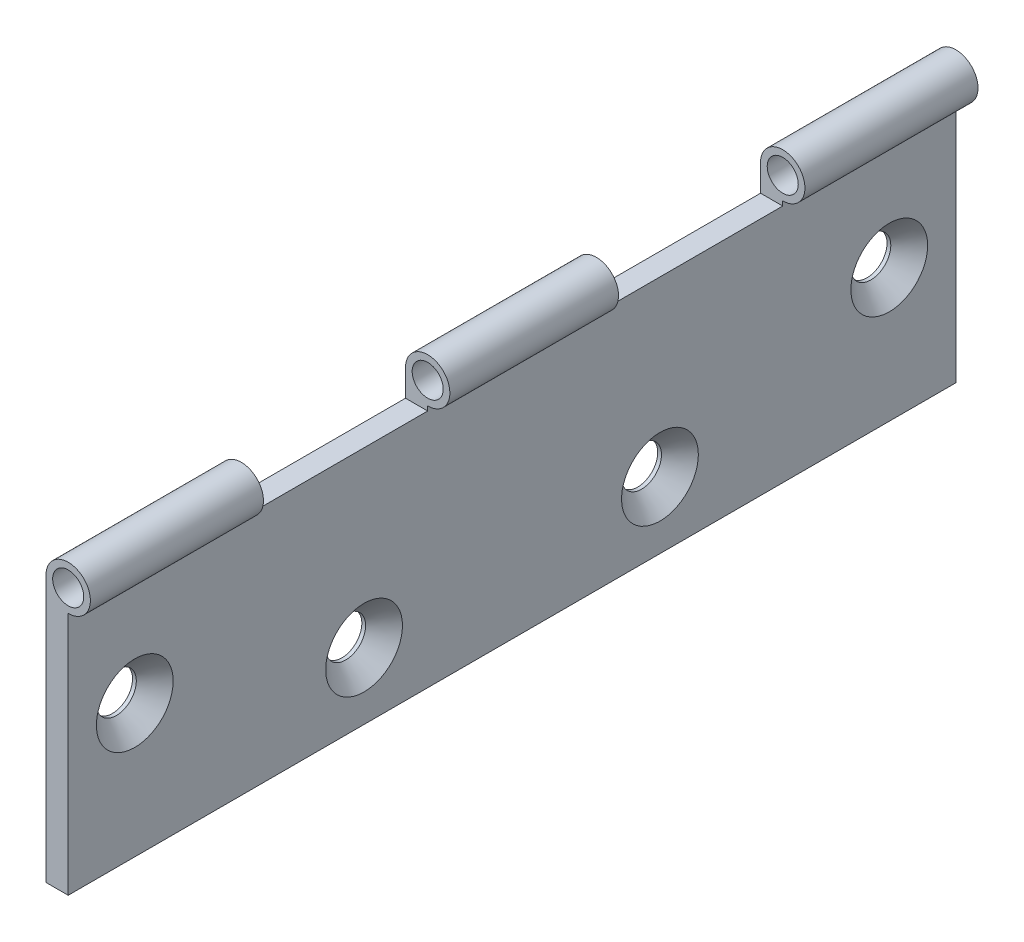
ISO-10303-21;
HEADER;
FILE_DESCRIPTION(('STEP AP214'),'2;1');
FILE_NAME('part.step','',(''),(''),'','','');
FILE_SCHEMA(('AUTOMOTIVE_DESIGN { 1 0 10303 214 1 1 1 1 }'));
ENDSEC;
DATA;
#1=APPLICATION_CONTEXT('core data for automotive mechanical design processes');
#2=APPLICATION_PROTOCOL_DEFINITION('international standard','automotive_design',2000,#1);
#3=PRODUCT_CONTEXT('',#1,'mechanical');
#4=PRODUCT('Part','Part','',(#3));
#5=PRODUCT_RELATED_PRODUCT_CATEGORY('part','',(#4));
#6=PRODUCT_DEFINITION_FORMATION('','',#4);
#7=PRODUCT_DEFINITION_CONTEXT('part definition',#1,'design');
#8=PRODUCT_DEFINITION('design','',#6,#7);
#9=PRODUCT_DEFINITION_SHAPE('','',#8);
#10=(LENGTH_UNIT() NAMED_UNIT(*) SI_UNIT(.MILLI.,.METRE.));
#11=(NAMED_UNIT(*) PLANE_ANGLE_UNIT() SI_UNIT($,.RADIAN.));
#12=(NAMED_UNIT(*) SI_UNIT($,.STERADIAN.) SOLID_ANGLE_UNIT());
#13=UNCERTAINTY_MEASURE_WITH_UNIT(LENGTH_MEASURE(1.E-05),#10,'distance_accuracy_value','');
#14=(GEOMETRIC_REPRESENTATION_CONTEXT(3) GLOBAL_UNCERTAINTY_ASSIGNED_CONTEXT((#13)) GLOBAL_UNIT_ASSIGNED_CONTEXT((#10,
#11,#12)) REPRESENTATION_CONTEXT('',''));
#15=CARTESIAN_POINT('',(0.,0.,0.));
#16=DIRECTION('',(0.,0.,1.));
#17=DIRECTION('',(1.,0.,0.));
#18=AXIS2_PLACEMENT_3D('',#15,#16,#17);
#19=CARTESIAN_POINT('',(5.,0.,100.));
#20=DIRECTION('',(-1.,0.,0.));
#21=DIRECTION('',(0.,0.,1.));
#22=AXIS2_PLACEMENT_3D('',#19,#20,#21);
#23=PLANE('',#22);
#24=CARTESIAN_POINT('',(5.,30.,85.));
#25=DIRECTION('',(1.,0.,0.));
#26=DIRECTION('',(0.,0.,-1.));
#27=AXIS2_PLACEMENT_3D('',#24,#25,#26);
#28=CIRCLE('',#27,8.65);
#29=CARTESIAN_POINT('',(5.,30.,76.35));
#30=VERTEX_POINT('',#29);
#31=EDGE_CURVE('E195',#30,#30,#28,.T.);
#32=ORIENTED_EDGE('',*,*,#31,.F.);
#33=EDGE_LOOP('',(#32));
#34=FACE_BOUND('',#33,.T.);
#35=CARTESIAN_POINT('',(5.,15.,33.3333333333333));
#36=DIRECTION('',(1.,0.,0.));
#37=DIRECTION('',(0.,0.,-1.));
#38=AXIS2_PLACEMENT_3D('',#35,#36,#37);
#39=CIRCLE('',#38,8.65);
#40=CARTESIAN_POINT('',(5.,15.,24.6833333333333));
#41=VERTEX_POINT('',#40);
#42=EDGE_CURVE('E207',#41,#41,#39,.T.);
#43=ORIENTED_EDGE('',*,*,#42,.F.);
#44=EDGE_LOOP('',(#43));
#45=FACE_BOUND('',#44,.T.);
#46=CARTESIAN_POINT('',(5.,15.,-33.3333333333333));
#47=DIRECTION('',(1.,0.,0.));
#48=DIRECTION('',(0.,0.,-1.));
#49=AXIS2_PLACEMENT_3D('',#46,#47,#48);
#50=CIRCLE('',#49,8.65);
#51=CARTESIAN_POINT('',(5.,15.,-41.9833333333333));
#52=VERTEX_POINT('',#51);
#53=EDGE_CURVE('E183',#52,#52,#50,.T.);
#54=ORIENTED_EDGE('',*,*,#53,.F.);
#55=EDGE_LOOP('',(#54));
#56=FACE_BOUND('',#55,.T.);
#57=CARTESIAN_POINT('',(5.,30.,-85.));
#58=DIRECTION('',(1.,0.,0.));
#59=DIRECTION('',(0.,0.,-1.));
#60=AXIS2_PLACEMENT_3D('',#57,#58,#59);
#61=CIRCLE('',#60,8.65);
#62=CARTESIAN_POINT('',(5.,30.,-93.65));
#63=VERTEX_POINT('',#62);
#64=EDGE_CURVE('E171',#63,#63,#61,.T.);
#65=ORIENTED_EDGE('',*,*,#64,.F.);
#66=EDGE_LOOP('',(#65));
#67=FACE_BOUND('',#66,.T.);
#68=DIRECTION('',(0.,-1.,0.));
#69=VECTOR('',#68,1.);
#70=CARTESIAN_POINT('',(5.,0.,61.));
#71=LINE('',#70,#69);
#72=CARTESIAN_POINT('',(5.,55.,61.));
#73=VERTEX_POINT('',#72);
#74=CARTESIAN_POINT('',(5.,54.,61.));
#75=VERTEX_POINT('',#74);
#76=EDGE_CURVE('E159',#73,#75,#71,.T.);
#77=ORIENTED_EDGE('',*,*,#76,.F.);
#78=DIRECTION('',(0.,0.,-1.));
#79=VECTOR('',#78,1.);
#80=CARTESIAN_POINT('',(5.,55.,100.));
#81=LINE('',#80,#79);
#82=CARTESIAN_POINT('',(5.,55.,100.));
#83=VERTEX_POINT('',#82);
#84=EDGE_CURVE('E104',#83,#73,#81,.T.);
#85=ORIENTED_EDGE('',*,*,#84,.F.);
#86=DIRECTION('',(0.,1.,0.));
#87=VECTOR('',#86,1.);
#88=CARTESIAN_POINT('',(5.,0.,100.));
#89=LINE('',#88,#87);
#90=CARTESIAN_POINT('',(5.,0.,100.));
#91=VERTEX_POINT('',#90);
#92=EDGE_CURVE('E88',#91,#83,#89,.T.);
#93=ORIENTED_EDGE('',*,*,#92,.F.);
#94=DIRECTION('',(0.,0.,-1.));
#95=VECTOR('',#94,1.);
#96=CARTESIAN_POINT('',(5.,0.,100.));
#97=LINE('',#96,#95);
#98=CARTESIAN_POINT('',(5.,0.,-100.));
#99=VERTEX_POINT('',#98);
#100=EDGE_CURVE('E66',#91,#99,#97,.T.);
#101=ORIENTED_EDGE('',*,*,#100,.T.);
#102=DIRECTION('',(0.,1.,0.));
#103=VECTOR('',#102,1.);
#104=CARTESIAN_POINT('',(5.,0.,-100.));
#105=LINE('',#104,#103);
#106=CARTESIAN_POINT('',(5.,55.,-100.));
#107=VERTEX_POINT('',#106);
#108=EDGE_CURVE('E85',#99,#107,#105,.T.);
#109=ORIENTED_EDGE('',*,*,#108,.T.);
#110=CARTESIAN_POINT('',(5.,55.,-61.));
#111=VERTEX_POINT('',#110);
#112=EDGE_CURVE('E233',#111,#107,#81,.T.);
#113=ORIENTED_EDGE('',*,*,#112,.F.);
#114=DIRECTION('',(0.,-1.,0.));
#115=VECTOR('',#114,1.);
#116=CARTESIAN_POINT('',(5.,0.,-61.));
#117=LINE('',#116,#115);
#118=CARTESIAN_POINT('',(5.,54.,-61.));
#119=VERTEX_POINT('',#118);
#120=EDGE_CURVE('E57',#111,#119,#117,.T.);
#121=ORIENTED_EDGE('',*,*,#120,.T.);
#122=DIRECTION('',(0.,0.,1.));
#123=VECTOR('',#122,1.);
#124=CARTESIAN_POINT('',(5.,54.,100.));
#125=LINE('',#124,#123);
#126=CARTESIAN_POINT('',(5.,54.,-19.));
#127=VERTEX_POINT('',#126);
#128=EDGE_CURVE('E163',#119,#127,#125,.T.);
#129=ORIENTED_EDGE('',*,*,#128,.T.);
#130=DIRECTION('',(0.,-1.,0.));
#131=VECTOR('',#130,1.);
#132=CARTESIAN_POINT('',(5.,0.,-19.));
#133=LINE('',#132,#131);
#134=CARTESIAN_POINT('',(5.,55.,-19.));
#135=VERTEX_POINT('',#134);
#136=EDGE_CURVE('E132',#135,#127,#133,.T.);
#137=ORIENTED_EDGE('',*,*,#136,.F.);
#138=CARTESIAN_POINT('',(5.,55.,19.));
#139=VERTEX_POINT('',#138);
#140=EDGE_CURVE('E236',#139,#135,#81,.T.);
#141=ORIENTED_EDGE('',*,*,#140,.F.);
#142=DIRECTION('',(0.,-1.,0.));
#143=VECTOR('',#142,1.);
#144=CARTESIAN_POINT('',(5.,0.,19.));
#145=LINE('',#144,#143);
#146=CARTESIAN_POINT('',(5.,54.,19.));
#147=VERTEX_POINT('',#146);
#148=EDGE_CURVE('E138',#139,#147,#145,.T.);
#149=ORIENTED_EDGE('',*,*,#148,.T.);
#150=DIRECTION('',(0.,0.,1.));
#151=VECTOR('',#150,1.);
#152=CARTESIAN_POINT('',(5.,54.,100.));
#153=LINE('',#152,#151);
#154=EDGE_CURVE('E167',#147,#75,#153,.T.);
#155=ORIENTED_EDGE('',*,*,#154,.T.);
#156=EDGE_LOOP('',(#77,#85,#93,#101,#109,#113,#121,#129,#137,#141,#149,#155));
#157=FACE_BOUND('',#156,.T.);
#158=ADVANCED_FACE('F39',(#34,#45,#56,#67,#157),#23,.F.);
#159=CARTESIAN_POINT('',(0.,0.,100.));
#160=DIRECTION('',(-1.,0.,0.));
#161=DIRECTION('',(0.,0.,1.));
#162=AXIS2_PLACEMENT_3D('',#159,#160,#161);
#163=PLANE('',#162);
#164=CARTESIAN_POINT('',(0.,15.,-33.3333333333333));
#165=DIRECTION('',(1.,0.,0.));
#166=DIRECTION('',(0.,0.,-1.));
#167=AXIS2_PLACEMENT_3D('',#164,#165,#166);
#168=CIRCLE('',#167,4.5);
#169=CARTESIAN_POINT('',(0.,15.,-37.8333333333333));
#170=VERTEX_POINT('',#169);
#171=EDGE_CURVE('E191',#170,#170,#168,.T.);
#172=ORIENTED_EDGE('',*,*,#171,.T.);
#173=EDGE_LOOP('',(#172));
#174=FACE_BOUND('',#173,.T.);
#175=CARTESIAN_POINT('',(0.,30.,85.));
#176=DIRECTION('',(1.,0.,0.));
#177=DIRECTION('',(0.,0.,-1.));
#178=AXIS2_PLACEMENT_3D('',#175,#176,#177);
#179=CIRCLE('',#178,4.5);
#180=CARTESIAN_POINT('',(0.,30.,80.5));
#181=VERTEX_POINT('',#180);
#182=EDGE_CURVE('E203',#181,#181,#179,.T.);
#183=ORIENTED_EDGE('',*,*,#182,.T.);
#184=EDGE_LOOP('',(#183));
#185=FACE_BOUND('',#184,.T.);
#186=CARTESIAN_POINT('',(0.,15.,33.3333333333333));
#187=DIRECTION('',(1.,0.,0.));
#188=DIRECTION('',(0.,0.,-1.));
#189=AXIS2_PLACEMENT_3D('',#186,#187,#188);
#190=CIRCLE('',#189,4.5);
#191=CARTESIAN_POINT('',(0.,15.,28.8333333333333));
#192=VERTEX_POINT('',#191);
#193=EDGE_CURVE('E215',#192,#192,#190,.T.);
#194=ORIENTED_EDGE('',*,*,#193,.T.);
#195=EDGE_LOOP('',(#194));
#196=FACE_BOUND('',#195,.T.);
#197=CARTESIAN_POINT('',(0.,30.,-85.));
#198=DIRECTION('',(1.,0.,0.));
#199=DIRECTION('',(0.,0.,-1.));
#200=AXIS2_PLACEMENT_3D('',#197,#198,#199);
#201=CIRCLE('',#200,4.5);
#202=CARTESIAN_POINT('',(0.,30.,-89.5));
#203=VERTEX_POINT('',#202);
#204=EDGE_CURVE('E179',#203,#203,#201,.T.);
#205=ORIENTED_EDGE('',*,*,#204,.T.);
#206=EDGE_LOOP('',(#205));
#207=FACE_BOUND('',#206,.T.);
#208=DIRECTION('',(0.,0.,-1.));
#209=VECTOR('',#208,1.);
#210=CARTESIAN_POINT('',(0.,60.,100.));
#211=LINE('',#210,#209);
#212=CARTESIAN_POINT('',(0.,60.,100.));
#213=VERTEX_POINT('',#212);
#214=CARTESIAN_POINT('',(0.,60.,61.));
#215=VERTEX_POINT('',#214);
#216=EDGE_CURVE('E11',#213,#215,#211,.T.);
#217=ORIENTED_EDGE('',*,*,#216,.T.);
#218=DIRECTION('',(0.,1.,0.));
#219=VECTOR('',#218,1.);
#220=CARTESIAN_POINT('',(0.,54.,61.));
#221=LINE('',#220,#219);
#222=CARTESIAN_POINT('',(0.,54.,61.));
#223=VERTEX_POINT('',#222);
#224=EDGE_CURVE('E311',#223,#215,#221,.T.);
#225=ORIENTED_EDGE('',*,*,#224,.F.);
#226=DIRECTION('',(0.,0.,-1.));
#227=VECTOR('',#226,1.);
#228=CARTESIAN_POINT('',(0.,54.,61.));
#229=LINE('',#228,#227);
#230=CARTESIAN_POINT('',(0.,54.,19.));
#231=VERTEX_POINT('',#230);
#232=EDGE_CURVE('E300',#223,#231,#229,.T.);
#233=ORIENTED_EDGE('',*,*,#232,.T.);
#234=DIRECTION('',(0.,1.,0.));
#235=VECTOR('',#234,1.);
#236=CARTESIAN_POINT('',(0.,54.,19.));
#237=LINE('',#236,#235);
#238=CARTESIAN_POINT('',(0.,60.,19.));
#239=VERTEX_POINT('',#238);
#240=EDGE_CURVE('E306',#231,#239,#237,.T.);
#241=ORIENTED_EDGE('',*,*,#240,.T.);
#242=CARTESIAN_POINT('',(0.,60.,-19.));
#243=VERTEX_POINT('',#242);
#244=EDGE_CURVE('E48',#239,#243,#211,.T.);
#245=ORIENTED_EDGE('',*,*,#244,.T.);
#246=DIRECTION('',(0.,1.,0.));
#247=VECTOR('',#246,1.);
#248=CARTESIAN_POINT('',(0.,54.,-19.));
#249=LINE('',#248,#247);
#250=CARTESIAN_POINT('',(0.,54.,-19.));
#251=VERTEX_POINT('',#250);
#252=EDGE_CURVE('E334',#251,#243,#249,.T.);
#253=ORIENTED_EDGE('',*,*,#252,.F.);
#254=DIRECTION('',(0.,0.,-1.));
#255=VECTOR('',#254,1.);
#256=CARTESIAN_POINT('',(0.,54.,-19.));
#257=LINE('',#256,#255);
#258=CARTESIAN_POINT('',(0.,54.,-61.));
#259=VERTEX_POINT('',#258);
#260=EDGE_CURVE('E326',#251,#259,#257,.T.);
#261=ORIENTED_EDGE('',*,*,#260,.T.);
#262=DIRECTION('',(0.,1.,0.));
#263=VECTOR('',#262,1.);
#264=CARTESIAN_POINT('',(0.,54.,-61.));
#265=LINE('',#264,#263);
#266=CARTESIAN_POINT('',(0.,60.,-61.));
#267=VERTEX_POINT('',#266);
#268=EDGE_CURVE('E330',#259,#267,#265,.T.);
#269=ORIENTED_EDGE('',*,*,#268,.T.);
#270=CARTESIAN_POINT('',(0.,60.,-100.));
#271=VERTEX_POINT('',#270);
#272=EDGE_CURVE('E50',#267,#271,#211,.T.);
#273=ORIENTED_EDGE('',*,*,#272,.T.);
#274=DIRECTION('',(0.,1.,0.));
#275=VECTOR('',#274,1.);
#276=CARTESIAN_POINT('',(0.,0.,-100.));
#277=LINE('',#276,#275);
#278=CARTESIAN_POINT('',(0.,0.,-100.));
#279=VERTEX_POINT('',#278);
#280=EDGE_CURVE('E103',#279,#271,#277,.T.);
#281=ORIENTED_EDGE('',*,*,#280,.F.);
#282=DIRECTION('',(0.,0.,-1.));
#283=VECTOR('',#282,1.);
#284=CARTESIAN_POINT('',(0.,0.,100.));
#285=LINE('',#284,#283);
#286=CARTESIAN_POINT('',(0.,0.,100.));
#287=VERTEX_POINT('',#286);
#288=EDGE_CURVE('E91',#287,#279,#285,.T.);
#289=ORIENTED_EDGE('',*,*,#288,.F.);
#290=DIRECTION('',(0.,1.,0.));
#291=VECTOR('',#290,1.);
#292=CARTESIAN_POINT('',(0.,0.,100.));
#293=LINE('',#292,#291);
#294=EDGE_CURVE('E112',#287,#213,#293,.T.);
#295=ORIENTED_EDGE('',*,*,#294,.T.);
#296=EDGE_LOOP('',(#217,#225,#233,#241,#245,#253,#261,#269,#273,#281,#289,#295));
#297=FACE_BOUND('',#296,.T.);
#298=ADVANCED_FACE('F248',(#174,#185,#196,#207,#297),#163,.T.);
#299=CARTESIAN_POINT('',(5.,60.,100.));
#300=DIRECTION('',(0.,0.,-1.));
#301=DIRECTION('',(-1.,0.,0.));
#302=AXIS2_PLACEMENT_3D('',#299,#300,#301);
#303=CYLINDRICAL_SURFACE('',#302,5.);
#304=CARTESIAN_POINT('',(5.,60.,61.));
#305=DIRECTION('',(0.,0.,-1.));
#306=DIRECTION('',(-1.,0.,0.));
#307=AXIS2_PLACEMENT_3D('',#304,#305,#306);
#308=CIRCLE('',#307,5.);
#309=EDGE_CURVE('E155',#215,#73,#308,.T.);
#310=ORIENTED_EDGE('',*,*,#309,.F.);
#311=ORIENTED_EDGE('',*,*,#216,.F.);
#312=CARTESIAN_POINT('',(5.,60.,100.));
#313=DIRECTION('',(0.,0.,1.));
#314=DIRECTION('',(1.,0.,0.));
#315=AXIS2_PLACEMENT_3D('',#312,#313,#314);
#316=CIRCLE('',#315,5.);
#317=EDGE_CURVE('E224',#83,#213,#316,.T.);
#318=ORIENTED_EDGE('',*,*,#317,.F.);
#319=ORIENTED_EDGE('',*,*,#84,.T.);
#320=EDGE_LOOP('',(#310,#311,#318,#319));
#321=FACE_BOUND('',#320,.T.);
#322=ADVANCED_FACE('F348',(#321),#303,.T.);
#323=ORIENTED_EDGE('',*,*,#244,.F.);
#324=CARTESIAN_POINT('',(5.,60.,19.));
#325=DIRECTION('',(0.,0.,-1.));
#326=DIRECTION('',(0.,1.,0.));
#327=AXIS2_PLACEMENT_3D('',#324,#325,#326);
#328=CIRCLE('',#327,5.);
#329=EDGE_CURVE('E131',#239,#139,#328,.T.);
#330=ORIENTED_EDGE('',*,*,#329,.T.);
#331=ORIENTED_EDGE('',*,*,#140,.T.);
#332=CARTESIAN_POINT('',(5.,60.,-19.));
#333=DIRECTION('',(0.,0.,-1.));
#334=DIRECTION('',(0.,1.,0.));
#335=AXIS2_PLACEMENT_3D('',#332,#333,#334);
#336=CIRCLE('',#335,5.);
#337=EDGE_CURVE('E127',#243,#135,#336,.T.);
#338=ORIENTED_EDGE('',*,*,#337,.F.);
#339=EDGE_LOOP('',(#323,#330,#331,#338));
#340=FACE_BOUND('',#339,.T.);
#341=ADVANCED_FACE('F346',(#340),#303,.T.);
#342=ORIENTED_EDGE('',*,*,#272,.F.);
#343=CARTESIAN_POINT('',(5.,60.,-61.));
#344=DIRECTION('',(0.,0.,-1.));
#345=DIRECTION('',(-1.,0.,0.));
#346=AXIS2_PLACEMENT_3D('',#343,#344,#345);
#347=CIRCLE('',#346,5.);
#348=EDGE_CURVE('E122',#267,#111,#347,.T.);
#349=ORIENTED_EDGE('',*,*,#348,.T.);
#350=ORIENTED_EDGE('',*,*,#112,.T.);
#351=CARTESIAN_POINT('',(5.,60.,-100.));
#352=DIRECTION('',(0.,0.,1.));
#353=DIRECTION('',(1.,0.,0.));
#354=AXIS2_PLACEMENT_3D('',#351,#352,#353);
#355=CIRCLE('',#354,5.);
#356=EDGE_CURVE('E101',#107,#271,#355,.T.);
#357=ORIENTED_EDGE('',*,*,#356,.T.);
#358=EDGE_LOOP('',(#342,#349,#350,#357));
#359=FACE_BOUND('',#358,.T.);
#360=ADVANCED_FACE('F427',(#359),#303,.T.);
#361=CARTESIAN_POINT('',(5.,60.,-100.));
#362=DIRECTION('',(0.,0.,1.));
#363=DIRECTION('',(1.,0.,0.));
#364=AXIS2_PLACEMENT_3D('',#361,#362,#363);
#365=CYLINDRICAL_SURFACE('',#364,3.5);
#366=CARTESIAN_POINT('',(5.,60.,100.));
#367=DIRECTION('',(0.,0.,1.));
#368=DIRECTION('',(1.,0.,0.));
#369=AXIS2_PLACEMENT_3D('',#366,#367,#368);
#370=CIRCLE('',#369,3.5);
#371=CARTESIAN_POINT('',(8.5,60.,100.));
#372=VERTEX_POINT('',#371);
#373=EDGE_CURVE('E219',#372,#372,#370,.T.);
#374=ORIENTED_EDGE('',*,*,#373,.T.);
#375=EDGE_LOOP('',(#374));
#376=FACE_BOUND('',#375,.T.);
#377=CARTESIAN_POINT('',(5.,60.,61.));
#378=DIRECTION('',(0.,0.,-1.));
#379=DIRECTION('',(-1.,0.,0.));
#380=AXIS2_PLACEMENT_3D('',#377,#378,#379);
#381=CIRCLE('',#380,3.5);
#382=CARTESIAN_POINT('',(1.5,60.,61.));
#383=VERTEX_POINT('',#382);
#384=EDGE_CURVE('E42',#383,#383,#381,.F.);
#385=ORIENTED_EDGE('',*,*,#384,.F.);
#386=EDGE_LOOP('',(#385));
#387=FACE_BOUND('',#386,.T.);
#388=ADVANCED_FACE('F424',(#376,#387),#365,.F.);
#389=CARTESIAN_POINT('',(5.,0.,100.));
#390=DIRECTION('',(0.,-1.,0.));
#391=DIRECTION('',(0.,0.,-1.));
#392=AXIS2_PLACEMENT_3D('',#389,#390,#391);
#393=PLANE('',#392);
#394=DIRECTION('',(-1.,0.,0.));
#395=VECTOR('',#394,1.);
#396=CARTESIAN_POINT('',(5.,0.,-100.));
#397=LINE('',#396,#395);
#398=EDGE_CURVE('E99',#99,#279,#397,.T.);
#399=ORIENTED_EDGE('',*,*,#398,.F.);
#400=ORIENTED_EDGE('',*,*,#100,.F.);
#401=DIRECTION('',(-1.,0.,0.));
#402=VECTOR('',#401,1.);
#403=CARTESIAN_POINT('',(5.,0.,100.));
#404=LINE('',#403,#402);
#405=EDGE_CURVE('E92',#91,#287,#404,.T.);
#406=ORIENTED_EDGE('',*,*,#405,.T.);
#407=ORIENTED_EDGE('',*,*,#288,.T.);
#408=EDGE_LOOP('',(#399,#400,#406,#407));
#409=FACE_BOUND('',#408,.T.);
#410=ADVANCED_FACE('F106',(#409),#393,.T.);
#411=CARTESIAN_POINT('',(0.,0.,100.));
#412=DIRECTION('',(0.,0.,-1.));
#413=DIRECTION('',(-1.,0.,0.));
#414=AXIS2_PLACEMENT_3D('',#411,#412,#413);
#415=PLANE('',#414);
#416=ORIENTED_EDGE('',*,*,#373,.F.);
#417=EDGE_LOOP('',(#416));
#418=FACE_BOUND('',#417,.T.);
#419=ORIENTED_EDGE('',*,*,#92,.T.);
#420=ORIENTED_EDGE('',*,*,#317,.T.);
#421=ORIENTED_EDGE('',*,*,#294,.F.);
#422=ORIENTED_EDGE('',*,*,#405,.F.);
#423=EDGE_LOOP('',(#419,#420,#421,#422));
#424=FACE_BOUND('',#423,.T.);
#425=ADVANCED_FACE('F244',(#418,#424),#415,.F.);
#426=CARTESIAN_POINT('',(0.,0.,-100.));
#427=DIRECTION('',(0.,0.,-1.));
#428=DIRECTION('',(-1.,0.,0.));
#429=AXIS2_PLACEMENT_3D('',#426,#427,#428);
#430=PLANE('',#429);
#431=CARTESIAN_POINT('',(5.,60.,-100.));
#432=DIRECTION('',(0.,0.,1.));
#433=DIRECTION('',(1.,0.,0.));
#434=AXIS2_PLACEMENT_3D('',#431,#432,#433);
#435=CIRCLE('',#434,3.5);
#436=CARTESIAN_POINT('',(8.5,60.,-100.));
#437=VERTEX_POINT('',#436);
#438=EDGE_CURVE('E220',#437,#437,#435,.T.);
#439=ORIENTED_EDGE('',*,*,#438,.T.);
#440=EDGE_LOOP('',(#439));
#441=FACE_BOUND('',#440,.T.);
#442=ORIENTED_EDGE('',*,*,#280,.T.);
#443=ORIENTED_EDGE('',*,*,#356,.F.);
#444=ORIENTED_EDGE('',*,*,#108,.F.);
#445=ORIENTED_EDGE('',*,*,#398,.T.);
#446=EDGE_LOOP('',(#442,#443,#444,#445));
#447=FACE_BOUND('',#446,.T.);
#448=ADVANCED_FACE('F98',(#441,#447),#430,.T.);
#449=CARTESIAN_POINT('',(5.,60.,-61.));
#450=DIRECTION('',(0.,0.,-1.));
#451=DIRECTION('',(-1.,0.,0.));
#452=AXIS2_PLACEMENT_3D('',#449,#450,#451);
#453=CIRCLE('',#452,3.5);
#454=CARTESIAN_POINT('',(1.5,60.,-61.));
#455=VERTEX_POINT('',#454);
#456=EDGE_CURVE('E118',#455,#455,#453,.F.);
#457=ORIENTED_EDGE('',*,*,#456,.T.);
#458=EDGE_LOOP('',(#457));
#459=FACE_BOUND('',#458,.T.);
#460=ORIENTED_EDGE('',*,*,#438,.F.);
#461=EDGE_LOOP('',(#460));
#462=FACE_BOUND('',#461,.T.);
#463=ADVANCED_FACE('F419',(#459,#462),#365,.F.);
#464=CARTESIAN_POINT('',(5.,15.,33.3333333333333));
#465=DIRECTION('',(1.,0.,0.));
#466=DIRECTION('',(0.,0.,-1.));
#467=AXIS2_PLACEMENT_3D('',#464,#465,#466);
#468=CYLINDRICAL_SURFACE('',#467,4.5);
#469=ORIENTED_EDGE('',*,*,#193,.F.);
#470=EDGE_LOOP('',(#469));
#471=FACE_BOUND('',#470,.T.);
#472=CARTESIAN_POINT('',(0.850000000000003,15.,33.3333333333333));
#473=DIRECTION('',(1.,0.,0.));
#474=DIRECTION('',(0.,0.,-1.));
#475=AXIS2_PLACEMENT_3D('',#472,#473,#474);
#476=CIRCLE('',#475,4.5);
#477=CARTESIAN_POINT('',(0.850000000000003,15.,28.8333333333333));
#478=VERTEX_POINT('',#477);
#479=EDGE_CURVE('E211',#478,#478,#476,.T.);
#480=ORIENTED_EDGE('',*,*,#479,.T.);
#481=EDGE_LOOP('',(#480));
#482=FACE_BOUND('',#481,.T.);
#483=ADVANCED_FACE('F415',(#471,#482),#468,.F.);
#484=CARTESIAN_POINT('',(5.,15.,33.3333333333333));
#485=DIRECTION('',(1.,0.,0.));
#486=DIRECTION('',(0.,0.,-1.));
#487=AXIS2_PLACEMENT_3D('',#484,#485,#486);
#488=CONICAL_SURFACE('',#487,8.65,0.785398163397448);
#489=ORIENTED_EDGE('',*,*,#479,.F.);
#490=EDGE_LOOP('',(#489));
#491=FACE_BOUND('',#490,.T.);
#492=ORIENTED_EDGE('',*,*,#42,.T.);
#493=EDGE_LOOP('',(#492));
#494=FACE_BOUND('',#493,.T.);
#495=ADVANCED_FACE('F411',(#491,#494),#488,.F.);
#496=CARTESIAN_POINT('',(5.,30.,85.));
#497=DIRECTION('',(1.,0.,0.));
#498=DIRECTION('',(0.,0.,-1.));
#499=AXIS2_PLACEMENT_3D('',#496,#497,#498);
#500=CYLINDRICAL_SURFACE('',#499,4.5);
#501=ORIENTED_EDGE('',*,*,#182,.F.);
#502=EDGE_LOOP('',(#501));
#503=FACE_BOUND('',#502,.T.);
#504=CARTESIAN_POINT('',(0.850000000000003,30.,85.));
#505=DIRECTION('',(1.,0.,0.));
#506=DIRECTION('',(0.,0.,-1.));
#507=AXIS2_PLACEMENT_3D('',#504,#505,#506);
#508=CIRCLE('',#507,4.5);
#509=CARTESIAN_POINT('',(0.850000000000003,30.,80.5));
#510=VERTEX_POINT('',#509);
#511=EDGE_CURVE('E199',#510,#510,#508,.T.);
#512=ORIENTED_EDGE('',*,*,#511,.T.);
#513=EDGE_LOOP('',(#512));
#514=FACE_BOUND('',#513,.T.);
#515=ADVANCED_FACE('F407',(#503,#514),#500,.F.);
#516=CARTESIAN_POINT('',(5.,30.,85.));
#517=DIRECTION('',(1.,0.,0.));
#518=DIRECTION('',(0.,0.,-1.));
#519=AXIS2_PLACEMENT_3D('',#516,#517,#518);
#520=CONICAL_SURFACE('',#519,8.65,0.785398163397449);
#521=ORIENTED_EDGE('',*,*,#511,.F.);
#522=EDGE_LOOP('',(#521));
#523=FACE_BOUND('',#522,.T.);
#524=ORIENTED_EDGE('',*,*,#31,.T.);
#525=EDGE_LOOP('',(#524));
#526=FACE_BOUND('',#525,.T.);
#527=ADVANCED_FACE('F403',(#523,#526),#520,.F.);
#528=CARTESIAN_POINT('',(5.,15.,-33.3333333333333));
#529=DIRECTION('',(1.,0.,0.));
#530=DIRECTION('',(0.,0.,-1.));
#531=AXIS2_PLACEMENT_3D('',#528,#529,#530);
#532=CYLINDRICAL_SURFACE('',#531,4.5);
#533=ORIENTED_EDGE('',*,*,#171,.F.);
#534=EDGE_LOOP('',(#533));
#535=FACE_BOUND('',#534,.T.);
#536=CARTESIAN_POINT('',(0.850000000000003,15.,-33.3333333333333));
#537=DIRECTION('',(1.,0.,0.));
#538=DIRECTION('',(0.,0.,-1.));
#539=AXIS2_PLACEMENT_3D('',#536,#537,#538);
#540=CIRCLE('',#539,4.5);
#541=CARTESIAN_POINT('',(0.850000000000003,15.,-37.8333333333333));
#542=VERTEX_POINT('',#541);
#543=EDGE_CURVE('E187',#542,#542,#540,.T.);
#544=ORIENTED_EDGE('',*,*,#543,.T.);
#545=EDGE_LOOP('',(#544));
#546=FACE_BOUND('',#545,.T.);
#547=ADVANCED_FACE('F399',(#535,#546),#532,.F.);
#548=CARTESIAN_POINT('',(5.,15.,-33.3333333333333));
#549=DIRECTION('',(1.,0.,0.));
#550=DIRECTION('',(0.,0.,-1.));
#551=AXIS2_PLACEMENT_3D('',#548,#549,#550);
#552=CONICAL_SURFACE('',#551,8.65,0.785398163397448);
#553=ORIENTED_EDGE('',*,*,#543,.F.);
#554=EDGE_LOOP('',(#553));
#555=FACE_BOUND('',#554,.T.);
#556=ORIENTED_EDGE('',*,*,#53,.T.);
#557=EDGE_LOOP('',(#556));
#558=FACE_BOUND('',#557,.T.);
#559=ADVANCED_FACE('F391',(#555,#558),#552,.F.);
#560=CARTESIAN_POINT('',(5.,30.,-85.));
#561=DIRECTION('',(1.,0.,0.));
#562=DIRECTION('',(0.,0.,-1.));
#563=AXIS2_PLACEMENT_3D('',#560,#561,#562);
#564=CYLINDRICAL_SURFACE('',#563,4.5);
#565=ORIENTED_EDGE('',*,*,#204,.F.);
#566=EDGE_LOOP('',(#565));
#567=FACE_BOUND('',#566,.T.);
#568=CARTESIAN_POINT('',(0.850000000000003,30.,-85.));
#569=DIRECTION('',(1.,0.,0.));
#570=DIRECTION('',(0.,0.,-1.));
#571=AXIS2_PLACEMENT_3D('',#568,#569,#570);
#572=CIRCLE('',#571,4.5);
#573=CARTESIAN_POINT('',(0.850000000000003,30.,-89.5));
#574=VERTEX_POINT('',#573);
#575=EDGE_CURVE('E175',#574,#574,#572,.T.);
#576=ORIENTED_EDGE('',*,*,#575,.T.);
#577=EDGE_LOOP('',(#576));
#578=FACE_BOUND('',#577,.T.);
#579=ADVANCED_FACE('F381',(#567,#578),#564,.F.);
#580=CARTESIAN_POINT('',(5.,30.,-85.));
#581=DIRECTION('',(1.,0.,0.));
#582=DIRECTION('',(0.,0.,-1.));
#583=AXIS2_PLACEMENT_3D('',#580,#581,#582);
#584=CONICAL_SURFACE('',#583,8.65,0.785398163397449);
#585=ORIENTED_EDGE('',*,*,#575,.F.);
#586=EDGE_LOOP('',(#585));
#587=FACE_BOUND('',#586,.T.);
#588=ORIENTED_EDGE('',*,*,#64,.T.);
#589=EDGE_LOOP('',(#588));
#590=FACE_BOUND('',#589,.T.);
#591=ADVANCED_FACE('F378',(#587,#590),#584,.F.);
#592=CARTESIAN_POINT('',(0.,54.,-19.));
#593=DIRECTION('',(0.,-1.,0.));
#594=DIRECTION('',(0.,0.,-1.));
#595=AXIS2_PLACEMENT_3D('',#592,#593,#594);
#596=PLANE('',#595);
#597=DIRECTION('',(1.,0.,0.));
#598=VECTOR('',#597,1.);
#599=CARTESIAN_POINT('',(0.,54.,-61.));
#600=LINE('',#599,#598);
#601=EDGE_CURVE('E320',#259,#119,#600,.T.);
#602=ORIENTED_EDGE('',*,*,#601,.F.);
#603=ORIENTED_EDGE('',*,*,#260,.F.);
#604=DIRECTION('',(1.,0.,0.));
#605=VECTOR('',#604,1.);
#606=CARTESIAN_POINT('',(0.,54.,-19.));
#607=LINE('',#606,#605);
#608=EDGE_CURVE('E323',#251,#127,#607,.T.);
#609=ORIENTED_EDGE('',*,*,#608,.T.);
#610=ORIENTED_EDGE('',*,*,#128,.F.);
#611=EDGE_LOOP('',(#602,#603,#609,#610));
#612=FACE_BOUND('',#611,.T.);
#613=ADVANCED_FACE('F380',(#612),#596,.F.);
#614=CARTESIAN_POINT('',(0.,54.,-19.));
#615=DIRECTION('',(0.,0.,-1.));
#616=DIRECTION('',(0.,1.,0.));
#617=AXIS2_PLACEMENT_3D('',#614,#615,#616);
#618=PLANE('',#617);
#619=CARTESIAN_POINT('',(5.,60.,-19.));
#620=DIRECTION('',(0.,0.,-1.));
#621=DIRECTION('',(0.,1.,0.));
#622=AXIS2_PLACEMENT_3D('',#619,#620,#621);
#623=CIRCLE('',#622,3.5);
#624=CARTESIAN_POINT('',(5.,63.5,-19.));
#625=VERTEX_POINT('',#624);
#626=EDGE_CURVE('E124',#625,#625,#623,.F.);
#627=ORIENTED_EDGE('',*,*,#626,.T.);
#628=EDGE_LOOP('',(#627));
#629=FACE_BOUND('',#628,.T.);
#630=ORIENTED_EDGE('',*,*,#136,.T.);
#631=ORIENTED_EDGE('',*,*,#608,.F.);
#632=ORIENTED_EDGE('',*,*,#252,.T.);
#633=ORIENTED_EDGE('',*,*,#337,.T.);
#634=EDGE_LOOP('',(#630,#631,#632,#633));
#635=FACE_BOUND('',#634,.T.);
#636=ADVANCED_FACE('F388',(#629,#635),#618,.T.);
#637=CARTESIAN_POINT('',(0.,54.,-61.));
#638=DIRECTION('',(0.,0.,-1.));
#639=DIRECTION('',(-1.,0.,0.));
#640=AXIS2_PLACEMENT_3D('',#637,#638,#639);
#641=PLANE('',#640);
#642=ORIENTED_EDGE('',*,*,#456,.F.);
#643=EDGE_LOOP('',(#642));
#644=FACE_BOUND('',#643,.T.);
#645=ORIENTED_EDGE('',*,*,#348,.F.);
#646=ORIENTED_EDGE('',*,*,#268,.F.);
#647=ORIENTED_EDGE('',*,*,#601,.T.);
#648=ORIENTED_EDGE('',*,*,#120,.F.);
#649=EDGE_LOOP('',(#645,#646,#647,#648));
#650=FACE_BOUND('',#649,.T.);
#651=ADVANCED_FACE('F444',(#644,#650),#641,.F.);
#652=CARTESIAN_POINT('',(5.,60.,19.));
#653=DIRECTION('',(0.,0.,-1.));
#654=DIRECTION('',(0.,1.,0.));
#655=AXIS2_PLACEMENT_3D('',#652,#653,#654);
#656=CIRCLE('',#655,3.5);
#657=CARTESIAN_POINT('',(5.,63.5,19.));
#658=VERTEX_POINT('',#657);
#659=EDGE_CURVE('E128',#658,#658,#656,.F.);
#660=ORIENTED_EDGE('',*,*,#659,.T.);
#661=EDGE_LOOP('',(#660));
#662=FACE_BOUND('',#661,.T.);
#663=ORIENTED_EDGE('',*,*,#626,.F.);
#664=EDGE_LOOP('',(#663));
#665=FACE_BOUND('',#664,.T.);
#666=ADVANCED_FACE('F360',(#662,#665),#365,.F.);
#667=CARTESIAN_POINT('',(0.,54.,61.));
#668=DIRECTION('',(0.,-1.,0.));
#669=DIRECTION('',(0.,0.,-1.));
#670=AXIS2_PLACEMENT_3D('',#667,#668,#669);
#671=PLANE('',#670);
#672=DIRECTION('',(1.,0.,0.));
#673=VECTOR('',#672,1.);
#674=CARTESIAN_POINT('',(0.,54.,19.));
#675=LINE('',#674,#673);
#676=EDGE_CURVE('E123',#231,#147,#675,.T.);
#677=ORIENTED_EDGE('',*,*,#676,.F.);
#678=ORIENTED_EDGE('',*,*,#232,.F.);
#679=DIRECTION('',(1.,0.,0.));
#680=VECTOR('',#679,1.);
#681=CARTESIAN_POINT('',(0.,54.,61.));
#682=LINE('',#681,#680);
#683=EDGE_CURVE('E303',#223,#75,#682,.T.);
#684=ORIENTED_EDGE('',*,*,#683,.T.);
#685=ORIENTED_EDGE('',*,*,#154,.F.);
#686=EDGE_LOOP('',(#677,#678,#684,#685));
#687=FACE_BOUND('',#686,.T.);
#688=ADVANCED_FACE('F297',(#687),#671,.F.);
#689=CARTESIAN_POINT('',(0.,54.,61.));
#690=DIRECTION('',(0.,0.,-1.));
#691=DIRECTION('',(-1.,0.,0.));
#692=AXIS2_PLACEMENT_3D('',#689,#690,#691);
#693=PLANE('',#692);
#694=ORIENTED_EDGE('',*,*,#384,.T.);
#695=EDGE_LOOP('',(#694));
#696=FACE_BOUND('',#695,.T.);
#697=ORIENTED_EDGE('',*,*,#76,.T.);
#698=ORIENTED_EDGE('',*,*,#683,.F.);
#699=ORIENTED_EDGE('',*,*,#224,.T.);
#700=ORIENTED_EDGE('',*,*,#309,.T.);
#701=EDGE_LOOP('',(#697,#698,#699,#700));
#702=FACE_BOUND('',#701,.T.);
#703=ADVANCED_FACE('F349',(#696,#702),#693,.T.);
#704=CARTESIAN_POINT('',(0.,54.,19.));
#705=DIRECTION('',(0.,0.,-1.));
#706=DIRECTION('',(0.,1.,0.));
#707=AXIS2_PLACEMENT_3D('',#704,#705,#706);
#708=PLANE('',#707);
#709=ORIENTED_EDGE('',*,*,#659,.F.);
#710=EDGE_LOOP('',(#709));
#711=FACE_BOUND('',#710,.T.);
#712=ORIENTED_EDGE('',*,*,#329,.F.);
#713=ORIENTED_EDGE('',*,*,#240,.F.);
#714=ORIENTED_EDGE('',*,*,#676,.T.);
#715=ORIENTED_EDGE('',*,*,#148,.F.);
#716=EDGE_LOOP('',(#712,#713,#714,#715));
#717=FACE_BOUND('',#716,.T.);
#718=ADVANCED_FACE('F307',(#711,#717),#708,.F.);
#719=CLOSED_SHELL('',(#158,#298,#322,#341,#360,#388,#410,#425,#448,#463,#483,#495,#515,#527,
#547,#559,#579,#591,#613,#636,#651,#666,#688,#703,#718));
#720=MANIFOLD_SOLID_BREP('B2',#719);
#721=ADVANCED_BREP_SHAPE_REPRESENTATION('',(#18,#720),#14);
#722=SHAPE_DEFINITION_REPRESENTATION(#9,#721);
ENDSEC;
END-ISO-10303-21;
